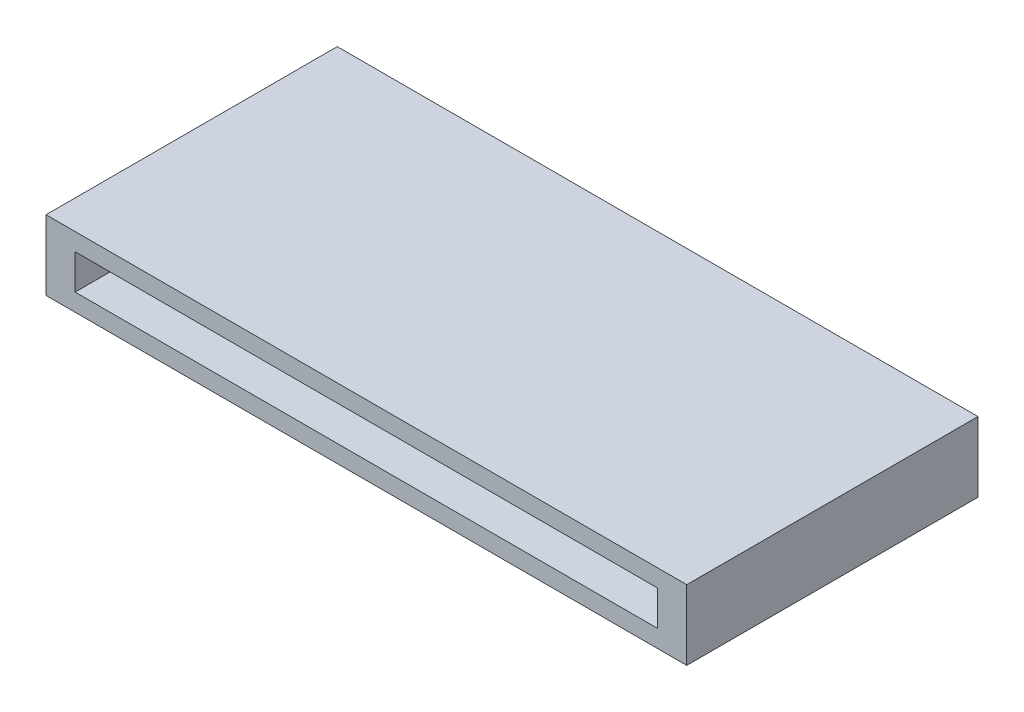
ISO-10303-21;
HEADER;
FILE_DESCRIPTION(('STEP AP214'),'2;1');
FILE_NAME('part.step','',(''),(''),'','','');
FILE_SCHEMA(('AUTOMOTIVE_DESIGN { 1 0 10303 214 1 1 1 1 }'));
ENDSEC;
DATA;
#1=APPLICATION_CONTEXT('core data for automotive mechanical design processes');
#2=APPLICATION_PROTOCOL_DEFINITION('international standard','automotive_design',2000,#1);
#3=PRODUCT_CONTEXT('',#1,'mechanical');
#4=PRODUCT('Part','Part','',(#3));
#5=PRODUCT_RELATED_PRODUCT_CATEGORY('part','',(#4));
#6=PRODUCT_DEFINITION_FORMATION('','',#4);
#7=PRODUCT_DEFINITION_CONTEXT('part definition',#1,'design');
#8=PRODUCT_DEFINITION('design','',#6,#7);
#9=PRODUCT_DEFINITION_SHAPE('','',#8);
#10=(LENGTH_UNIT() NAMED_UNIT(*) SI_UNIT(.MILLI.,.METRE.));
#11=(NAMED_UNIT(*) PLANE_ANGLE_UNIT() SI_UNIT($,.RADIAN.));
#12=(NAMED_UNIT(*) SI_UNIT($,.STERADIAN.) SOLID_ANGLE_UNIT());
#13=UNCERTAINTY_MEASURE_WITH_UNIT(LENGTH_MEASURE(1.E-05),#10,'distance_accuracy_value','');
#14=(GEOMETRIC_REPRESENTATION_CONTEXT(3) GLOBAL_UNCERTAINTY_ASSIGNED_CONTEXT((#13)) GLOBAL_UNIT_ASSIGNED_CONTEXT((#10,
#11,#12)) REPRESENTATION_CONTEXT('',''));
#15=CARTESIAN_POINT('',(0.,0.,0.));
#16=DIRECTION('',(0.,0.,1.));
#17=DIRECTION('',(1.,0.,0.));
#18=AXIS2_PLACEMENT_3D('',#15,#16,#17);
#19=CARTESIAN_POINT('',(0.,0.,5.));
#20=DIRECTION('',(0.,0.,1.));
#21=DIRECTION('',(1.,0.,0.));
#22=AXIS2_PLACEMENT_3D('',#19,#20,#21);
#23=PLANE('',#22);
#24=DIRECTION('',(0.,1.,0.));
#25=VECTOR('',#24,1.);
#26=CARTESIAN_POINT('',(5.49999999999997,0.6,5.));
#27=LINE('',#26,#25);
#28=CARTESIAN_POINT('',(5.49999999999997,-0.6,5.));
#29=VERTEX_POINT('',#28);
#30=CARTESIAN_POINT('',(5.49999999999997,0.6,5.));
#31=VERTEX_POINT('',#30);
#32=EDGE_CURVE('E136',#29,#31,#27,.T.);
#33=ORIENTED_EDGE('',*,*,#32,.T.);
#34=DIRECTION('',(-1.,0.,0.));
#35=VECTOR('',#34,1.);
#36=CARTESIAN_POINT('',(-5.50000000000003,0.6,5.));
#37=LINE('',#36,#35);
#38=CARTESIAN_POINT('',(-5.50000000000003,0.6,5.));
#39=VERTEX_POINT('',#38);
#40=EDGE_CURVE('E139',#31,#39,#37,.T.);
#41=ORIENTED_EDGE('',*,*,#40,.T.);
#42=DIRECTION('',(0.,-1.,0.));
#43=VECTOR('',#42,1.);
#44=CARTESIAN_POINT('',(-5.50000000000003,0.6,5.));
#45=LINE('',#44,#43);
#46=CARTESIAN_POINT('',(-5.50000000000003,-0.6,5.));
#47=VERTEX_POINT('',#46);
#48=EDGE_CURVE('E142',#39,#47,#45,.T.);
#49=ORIENTED_EDGE('',*,*,#48,.T.);
#50=DIRECTION('',(1.,0.,0.));
#51=VECTOR('',#50,1.);
#52=CARTESIAN_POINT('',(-5.50000000000003,-0.6,5.));
#53=LINE('',#52,#51);
#54=EDGE_CURVE('E144',#47,#29,#53,.T.);
#55=ORIENTED_EDGE('',*,*,#54,.T.);
#56=EDGE_LOOP('',(#33,#41,#49,#55));
#57=FACE_BOUND('',#56,.T.);
#58=DIRECTION('',(-1.,0.,0.));
#59=VECTOR('',#58,1.);
#60=CARTESIAN_POINT('',(-5.00000000000003,0.300000000000002,5.));
#61=LINE('',#60,#59);
#62=CARTESIAN_POINT('',(4.99999999999997,0.300000000000002,5.));
#63=VERTEX_POINT('',#62);
#64=CARTESIAN_POINT('',(-5.00000000000003,0.300000000000002,5.));
#65=VERTEX_POINT('',#64);
#66=EDGE_CURVE('E108',#63,#65,#61,.T.);
#67=ORIENTED_EDGE('',*,*,#66,.F.);
#68=DIRECTION('',(0.,1.,0.));
#69=VECTOR('',#68,1.);
#70=CARTESIAN_POINT('',(4.99999999999997,-0.300000000000002,5.));
#71=LINE('',#70,#69);
#72=CARTESIAN_POINT('',(4.99999999999997,-0.300000000000002,5.));
#73=VERTEX_POINT('',#72);
#74=EDGE_CURVE('E100',#73,#63,#71,.T.);
#75=ORIENTED_EDGE('',*,*,#74,.F.);
#76=DIRECTION('',(1.,0.,0.));
#77=VECTOR('',#76,1.);
#78=CARTESIAN_POINT('',(-5.00000000000003,-0.300000000000002,5.));
#79=LINE('',#78,#77);
#80=CARTESIAN_POINT('',(-5.00000000000003,-0.300000000000002,5.));
#81=VERTEX_POINT('',#80);
#82=EDGE_CURVE('E122',#81,#73,#79,.T.);
#83=ORIENTED_EDGE('',*,*,#82,.F.);
#84=DIRECTION('',(0.,-1.,0.));
#85=VECTOR('',#84,1.);
#86=CARTESIAN_POINT('',(-5.00000000000003,-0.300000000000002,5.));
#87=LINE('',#86,#85);
#88=EDGE_CURVE('E120',#65,#81,#87,.T.);
#89=ORIENTED_EDGE('',*,*,#88,.F.);
#90=EDGE_LOOP('',(#67,#75,#83,#89));
#91=FACE_BOUND('',#90,.T.);
#92=ADVANCED_FACE('F35',(#57,#91),#23,.T.);
#93=CARTESIAN_POINT('',(0.,0.,0.));
#94=DIRECTION('',(0.,0.,1.));
#95=DIRECTION('',(1.,0.,0.));
#96=AXIS2_PLACEMENT_3D('',#93,#94,#95);
#97=PLANE('',#96);
#98=DIRECTION('',(0.,1.,0.));
#99=VECTOR('',#98,1.);
#100=CARTESIAN_POINT('',(5.49999999999997,0.6,0.));
#101=LINE('',#100,#99);
#102=CARTESIAN_POINT('',(5.49999999999997,-0.6,0.));
#103=VERTEX_POINT('',#102);
#104=CARTESIAN_POINT('',(5.49999999999997,0.6,0.));
#105=VERTEX_POINT('',#104);
#106=EDGE_CURVE('E116',#103,#105,#101,.T.);
#107=ORIENTED_EDGE('',*,*,#106,.F.);
#108=DIRECTION('',(1.,0.,0.));
#109=VECTOR('',#108,1.);
#110=CARTESIAN_POINT('',(-5.50000000000003,-0.6,0.));
#111=LINE('',#110,#109);
#112=CARTESIAN_POINT('',(-5.50000000000003,-0.6,0.));
#113=VERTEX_POINT('',#112);
#114=EDGE_CURVE('E140',#113,#103,#111,.T.);
#115=ORIENTED_EDGE('',*,*,#114,.F.);
#116=DIRECTION('',(0.,-1.,0.));
#117=VECTOR('',#116,1.);
#118=CARTESIAN_POINT('',(-5.50000000000003,0.6,0.));
#119=LINE('',#118,#117);
#120=CARTESIAN_POINT('',(-5.50000000000003,0.6,0.));
#121=VERTEX_POINT('',#120);
#122=EDGE_CURVE('E151',#121,#113,#119,.T.);
#123=ORIENTED_EDGE('',*,*,#122,.F.);
#124=DIRECTION('',(-1.,0.,0.));
#125=VECTOR('',#124,1.);
#126=CARTESIAN_POINT('',(-5.50000000000003,0.6,0.));
#127=LINE('',#126,#125);
#128=EDGE_CURVE('E149',#105,#121,#127,.T.);
#129=ORIENTED_EDGE('',*,*,#128,.F.);
#130=EDGE_LOOP('',(#107,#115,#123,#129));
#131=FACE_BOUND('',#130,.T.);
#132=DIRECTION('',(0.,1.,0.));
#133=VECTOR('',#132,1.);
#134=CARTESIAN_POINT('',(4.99999999999997,-0.300000000000002,0.));
#135=LINE('',#134,#133);
#136=CARTESIAN_POINT('',(4.99999999999997,-0.300000000000002,0.));
#137=VERTEX_POINT('',#136);
#138=CARTESIAN_POINT('',(4.99999999999997,0.300000000000002,0.));
#139=VERTEX_POINT('',#138);
#140=EDGE_CURVE('E58',#137,#139,#135,.T.);
#141=ORIENTED_EDGE('',*,*,#140,.T.);
#142=DIRECTION('',(-1.,0.,0.));
#143=VECTOR('',#142,1.);
#144=CARTESIAN_POINT('',(-5.00000000000003,0.300000000000002,0.));
#145=LINE('',#144,#143);
#146=CARTESIAN_POINT('',(-5.00000000000003,0.300000000000002,0.));
#147=VERTEX_POINT('',#146);
#148=EDGE_CURVE('E115',#139,#147,#145,.T.);
#149=ORIENTED_EDGE('',*,*,#148,.T.);
#150=DIRECTION('',(0.,-1.,0.));
#151=VECTOR('',#150,1.);
#152=CARTESIAN_POINT('',(-5.00000000000003,-0.300000000000002,0.));
#153=LINE('',#152,#151);
#154=CARTESIAN_POINT('',(-5.00000000000003,-0.300000000000002,0.));
#155=VERTEX_POINT('',#154);
#156=EDGE_CURVE('E128',#147,#155,#153,.T.);
#157=ORIENTED_EDGE('',*,*,#156,.T.);
#158=DIRECTION('',(1.,0.,0.));
#159=VECTOR('',#158,1.);
#160=CARTESIAN_POINT('',(-5.00000000000003,-0.300000000000002,0.));
#161=LINE('',#160,#159);
#162=EDGE_CURVE('E109',#155,#137,#161,.T.);
#163=ORIENTED_EDGE('',*,*,#162,.T.);
#164=EDGE_LOOP('',(#141,#149,#157,#163));
#165=FACE_BOUND('',#164,.T.);
#166=ADVANCED_FACE('F169',(#131,#165),#97,.F.);
#167=CARTESIAN_POINT('',(5.49999999999997,0.6,5.));
#168=DIRECTION('',(-1.,0.,0.));
#169=DIRECTION('',(0.,0.,1.));
#170=AXIS2_PLACEMENT_3D('',#167,#168,#169);
#171=PLANE('',#170);
#172=ORIENTED_EDGE('',*,*,#106,.T.);
#173=DIRECTION('',(0.,0.,-1.));
#174=VECTOR('',#173,1.);
#175=CARTESIAN_POINT('',(5.49999999999997,0.6,5.));
#176=LINE('',#175,#174);
#177=EDGE_CURVE('E11',#31,#105,#176,.T.);
#178=ORIENTED_EDGE('',*,*,#177,.F.);
#179=ORIENTED_EDGE('',*,*,#32,.F.);
#180=DIRECTION('',(0.,0.,-1.));
#181=VECTOR('',#180,1.);
#182=CARTESIAN_POINT('',(5.49999999999997,-0.6,5.));
#183=LINE('',#182,#181);
#184=EDGE_CURVE('E146',#29,#103,#183,.T.);
#185=ORIENTED_EDGE('',*,*,#184,.T.);
#186=EDGE_LOOP('',(#172,#178,#179,#185));
#187=FACE_BOUND('',#186,.T.);
#188=ADVANCED_FACE('F37',(#187),#171,.F.);
#189=CARTESIAN_POINT('',(-5.50000000000003,0.6,5.));
#190=DIRECTION('',(0.,-1.,0.));
#191=DIRECTION('',(0.,0.,-1.));
#192=AXIS2_PLACEMENT_3D('',#189,#190,#191);
#193=PLANE('',#192);
#194=ORIENTED_EDGE('',*,*,#128,.T.);
#195=DIRECTION('',(0.,0.,-1.));
#196=VECTOR('',#195,1.);
#197=CARTESIAN_POINT('',(-5.50000000000003,0.6,5.));
#198=LINE('',#197,#196);
#199=EDGE_CURVE('E43',#39,#121,#198,.T.);
#200=ORIENTED_EDGE('',*,*,#199,.F.);
#201=ORIENTED_EDGE('',*,*,#40,.F.);
#202=ORIENTED_EDGE('',*,*,#177,.T.);
#203=EDGE_LOOP('',(#194,#200,#201,#202));
#204=FACE_BOUND('',#203,.T.);
#205=ADVANCED_FACE('F179',(#204),#193,.F.);
#206=CARTESIAN_POINT('',(-5.50000000000003,0.6,5.));
#207=DIRECTION('',(1.,0.,0.));
#208=DIRECTION('',(0.,0.,-1.));
#209=AXIS2_PLACEMENT_3D('',#206,#207,#208);
#210=PLANE('',#209);
#211=ORIENTED_EDGE('',*,*,#122,.T.);
#212=DIRECTION('',(0.,0.,-1.));
#213=VECTOR('',#212,1.);
#214=CARTESIAN_POINT('',(-5.50000000000003,-0.6,5.));
#215=LINE('',#214,#213);
#216=EDGE_CURVE('E156',#47,#113,#215,.T.);
#217=ORIENTED_EDGE('',*,*,#216,.F.);
#218=ORIENTED_EDGE('',*,*,#48,.F.);
#219=ORIENTED_EDGE('',*,*,#199,.T.);
#220=EDGE_LOOP('',(#211,#217,#218,#219));
#221=FACE_BOUND('',#220,.T.);
#222=ADVANCED_FACE('F163',(#221),#210,.F.);
#223=CARTESIAN_POINT('',(-5.50000000000003,-0.6,5.));
#224=DIRECTION('',(0.,1.,0.));
#225=DIRECTION('',(0.,0.,1.));
#226=AXIS2_PLACEMENT_3D('',#223,#224,#225);
#227=PLANE('',#226);
#228=ORIENTED_EDGE('',*,*,#114,.T.);
#229=ORIENTED_EDGE('',*,*,#184,.F.);
#230=ORIENTED_EDGE('',*,*,#54,.F.);
#231=ORIENTED_EDGE('',*,*,#216,.T.);
#232=EDGE_LOOP('',(#228,#229,#230,#231));
#233=FACE_BOUND('',#232,.T.);
#234=ADVANCED_FACE('F173',(#233),#227,.F.);
#235=CARTESIAN_POINT('',(4.99999999999997,-0.300000000000002,5.));
#236=DIRECTION('',(-1.,0.,0.));
#237=DIRECTION('',(0.,0.,1.));
#238=AXIS2_PLACEMENT_3D('',#235,#236,#237);
#239=PLANE('',#238);
#240=ORIENTED_EDGE('',*,*,#140,.F.);
#241=DIRECTION('',(0.,0.,-1.));
#242=VECTOR('',#241,1.);
#243=CARTESIAN_POINT('',(4.99999999999997,-0.300000000000002,5.));
#244=LINE('',#243,#242);
#245=EDGE_CURVE('E104',#73,#137,#244,.T.);
#246=ORIENTED_EDGE('',*,*,#245,.F.);
#247=ORIENTED_EDGE('',*,*,#74,.T.);
#248=DIRECTION('',(0.,0.,-1.));
#249=VECTOR('',#248,1.);
#250=CARTESIAN_POINT('',(4.99999999999997,0.300000000000002,5.));
#251=LINE('',#250,#249);
#252=EDGE_CURVE('E103',#63,#139,#251,.T.);
#253=ORIENTED_EDGE('',*,*,#252,.T.);
#254=EDGE_LOOP('',(#240,#246,#247,#253));
#255=FACE_BOUND('',#254,.T.);
#256=ADVANCED_FACE('F102',(#255),#239,.T.);
#257=CARTESIAN_POINT('',(-5.00000000000003,0.300000000000002,5.));
#258=DIRECTION('',(0.,-1.,0.));
#259=DIRECTION('',(0.,0.,-1.));
#260=AXIS2_PLACEMENT_3D('',#257,#258,#259);
#261=PLANE('',#260);
#262=ORIENTED_EDGE('',*,*,#148,.F.);
#263=ORIENTED_EDGE('',*,*,#252,.F.);
#264=ORIENTED_EDGE('',*,*,#66,.T.);
#265=DIRECTION('',(0.,0.,-1.));
#266=VECTOR('',#265,1.);
#267=CARTESIAN_POINT('',(-5.00000000000003,0.300000000000002,5.));
#268=LINE('',#267,#266);
#269=EDGE_CURVE('E117',#65,#147,#268,.T.);
#270=ORIENTED_EDGE('',*,*,#269,.T.);
#271=EDGE_LOOP('',(#262,#263,#264,#270));
#272=FACE_BOUND('',#271,.T.);
#273=ADVANCED_FACE('F112',(#272),#261,.T.);
#274=CARTESIAN_POINT('',(-5.00000000000003,-0.300000000000002,5.));
#275=DIRECTION('',(1.,0.,0.));
#276=DIRECTION('',(0.,0.,-1.));
#277=AXIS2_PLACEMENT_3D('',#274,#275,#276);
#278=PLANE('',#277);
#279=ORIENTED_EDGE('',*,*,#156,.F.);
#280=ORIENTED_EDGE('',*,*,#269,.F.);
#281=ORIENTED_EDGE('',*,*,#88,.T.);
#282=DIRECTION('',(0.,0.,-1.));
#283=VECTOR('',#282,1.);
#284=CARTESIAN_POINT('',(-5.00000000000003,-0.300000000000002,5.));
#285=LINE('',#284,#283);
#286=EDGE_CURVE('E50',#81,#155,#285,.T.);
#287=ORIENTED_EDGE('',*,*,#286,.T.);
#288=EDGE_LOOP('',(#279,#280,#281,#287));
#289=FACE_BOUND('',#288,.T.);
#290=ADVANCED_FACE('F202',(#289),#278,.T.);
#291=CARTESIAN_POINT('',(-5.00000000000003,-0.300000000000002,5.));
#292=DIRECTION('',(0.,1.,0.));
#293=DIRECTION('',(0.,0.,1.));
#294=AXIS2_PLACEMENT_3D('',#291,#292,#293);
#295=PLANE('',#294);
#296=ORIENTED_EDGE('',*,*,#162,.F.);
#297=ORIENTED_EDGE('',*,*,#286,.F.);
#298=ORIENTED_EDGE('',*,*,#82,.T.);
#299=ORIENTED_EDGE('',*,*,#245,.T.);
#300=EDGE_LOOP('',(#296,#297,#298,#299));
#301=FACE_BOUND('',#300,.T.);
#302=ADVANCED_FACE('F206',(#301),#295,.T.);
#303=CLOSED_SHELL('',(#92,#166,#188,#205,#222,#234,#256,#273,#290,#302));
#304=MANIFOLD_SOLID_BREP('B2',#303);
#305=ADVANCED_BREP_SHAPE_REPRESENTATION('',(#18,#304),#14);
#306=SHAPE_DEFINITION_REPRESENTATION(#9,#305);
ENDSEC;
END-ISO-10303-21;
